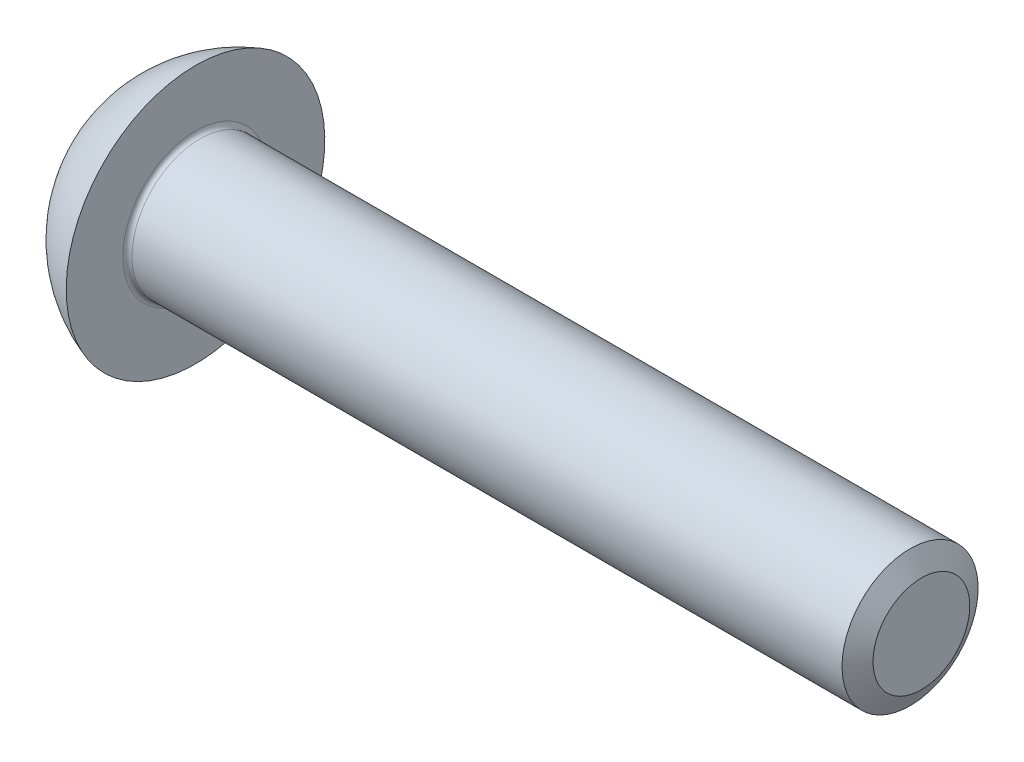
ISO-10303-21;
HEADER;
FILE_DESCRIPTION(('STEP AP214'),'2;1');
FILE_NAME('part.step','',(''),(''),'','','');
FILE_SCHEMA(('AUTOMOTIVE_DESIGN { 1 0 10303 214 1 1 1 1 }'));
ENDSEC;
DATA;
#1=APPLICATION_CONTEXT('core data for automotive mechanical design processes');
#2=APPLICATION_PROTOCOL_DEFINITION('international standard','automotive_design',2000,#1);
#3=PRODUCT_CONTEXT('',#1,'mechanical');
#4=PRODUCT('Part','Part','',(#3));
#5=PRODUCT_RELATED_PRODUCT_CATEGORY('part','',(#4));
#6=PRODUCT_DEFINITION_FORMATION('','',#4);
#7=PRODUCT_DEFINITION_CONTEXT('part definition',#1,'design');
#8=PRODUCT_DEFINITION('design','',#6,#7);
#9=PRODUCT_DEFINITION_SHAPE('','',#8);
#10=(LENGTH_UNIT() NAMED_UNIT(*) SI_UNIT(.MILLI.,.METRE.));
#11=(NAMED_UNIT(*) PLANE_ANGLE_UNIT() SI_UNIT($,.RADIAN.));
#12=(NAMED_UNIT(*) SI_UNIT($,.STERADIAN.) SOLID_ANGLE_UNIT());
#13=UNCERTAINTY_MEASURE_WITH_UNIT(LENGTH_MEASURE(1.E-05),#10,'distance_accuracy_value','');
#14=(GEOMETRIC_REPRESENTATION_CONTEXT(3) GLOBAL_UNCERTAINTY_ASSIGNED_CONTEXT((#13)) GLOBAL_UNIT_ASSIGNED_CONTEXT((#10,
#11,#12)) REPRESENTATION_CONTEXT('',''));
#15=CARTESIAN_POINT('',(0.,0.,0.));
#16=DIRECTION('',(0.,0.,1.));
#17=DIRECTION('',(1.,0.,0.));
#18=AXIS2_PLACEMENT_3D('',#15,#16,#17);
#19=CARTESIAN_POINT('',(-17.65,0.,0.));
#20=DIRECTION('',(-1.,0.,0.));
#21=DIRECTION('',(0.,0.,1.));
#22=AXIS2_PLACEMENT_3D('',#19,#20,#21);
#23=CYLINDRICAL_SURFACE('',#22,1.5);
#24=CARTESIAN_POINT('',(-15.9,0.,0.));
#25=DIRECTION('',(-1.,0.,0.));
#26=DIRECTION('',(0.,0.,1.));
#27=AXIS2_PLACEMENT_3D('',#24,#25,#26);
#28=CIRCLE('',#27,1.5);
#29=CARTESIAN_POINT('',(-15.9,0.,1.5));
#30=VERTEX_POINT('',#29);
#31=EDGE_CURVE('E260',#30,#30,#28,.T.);
#32=ORIENTED_EDGE('',*,*,#31,.F.);
#33=EDGE_LOOP('',(#32));
#34=FACE_BOUND('',#33,.T.);
#35=CARTESIAN_POINT('',(-0.25,0.,0.));
#36=DIRECTION('',(-1.,0.,0.));
#37=DIRECTION('',(0.,0.,1.));
#38=AXIS2_PLACEMENT_3D('',#35,#36,#37);
#39=CIRCLE('',#38,1.5);
#40=CARTESIAN_POINT('',(-0.25,0.,1.5));
#41=VERTEX_POINT('',#40);
#42=EDGE_CURVE('E405',#41,#41,#39,.T.);
#43=ORIENTED_EDGE('',*,*,#42,.T.);
#44=EDGE_LOOP('',(#43));
#45=FACE_BOUND('',#44,.T.);
#46=ADVANCED_FACE('F39',(#34,#45),#23,.T.);
#47=CARTESIAN_POINT('',(-17.65,0.,0.));
#48=DIRECTION('',(1.,0.,0.));
#49=DIRECTION('',(0.,0.,-1.));
#50=AXIS2_PLACEMENT_3D('',#47,#48,#49);
#51=PLANE('',#50);
#52=CARTESIAN_POINT('',(-17.65,0.,0.));
#53=DIRECTION('',(-1.,0.,0.));
#54=DIRECTION('',(0.,0.,1.));
#55=AXIS2_PLACEMENT_3D('',#52,#53,#54);
#56=CIRCLE('',#55,1.5);
#57=CARTESIAN_POINT('',(-17.65,1.5,0.));
#58=VERTEX_POINT('',#57);
#59=EDGE_CURVE('E252',#58,#58,#56,.T.);
#60=ORIENTED_EDGE('',*,*,#59,.T.);
#61=EDGE_LOOP('',(#60));
#62=FACE_BOUND('',#61,.T.);
#63=CARTESIAN_POINT('',(-17.65,0.,0.));
#64=DIRECTION('',(1.,0.,0.));
#65=DIRECTION('',(0.,0.,-1.));
#66=AXIS2_PLACEMENT_3D('',#63,#64,#65);
#67=CIRCLE('',#66,1.15470053837925);
#68=CARTESIAN_POINT('',(-17.65,-0.577350269189627,-1.));
#69=VERTEX_POINT('',#68);
#70=CARTESIAN_POINT('',(-17.65,-1.15470053837925,0.));
#71=VERTEX_POINT('',#70);
#72=EDGE_CURVE('E11',#69,#71,#67,.F.);
#73=ORIENTED_EDGE('',*,*,#72,.F.);
#74=CARTESIAN_POINT('',(-17.65,0.577350269189628,-1.));
#75=VERTEX_POINT('',#74);
#76=EDGE_CURVE('E43',#75,#69,#67,.F.);
#77=ORIENTED_EDGE('',*,*,#76,.F.);
#78=CARTESIAN_POINT('',(-17.65,1.15470053837925,0.));
#79=VERTEX_POINT('',#78);
#80=EDGE_CURVE('E112',#79,#75,#67,.F.);
#81=ORIENTED_EDGE('',*,*,#80,.F.);
#82=CARTESIAN_POINT('',(-17.65,0.,0.));
#83=DIRECTION('',(-1.,0.,0.));
#84=DIRECTION('',(0.,0.,1.));
#85=AXIS2_PLACEMENT_3D('',#82,#83,#84);
#86=CIRCLE('',#85,1.15470053837925);
#87=CARTESIAN_POINT('',(-17.65,0.577350269189629,1.));
#88=VERTEX_POINT('',#87);
#89=EDGE_CURVE('E132',#88,#79,#86,.T.);
#90=ORIENTED_EDGE('',*,*,#89,.F.);
#91=CARTESIAN_POINT('',(-17.65,-0.577350269189633,0.999999999999999));
#92=VERTEX_POINT('',#91);
#93=EDGE_CURVE('E326',#92,#88,#67,.F.);
#94=ORIENTED_EDGE('',*,*,#93,.F.);
#95=EDGE_CURVE('E48',#71,#92,#67,.F.);
#96=ORIENTED_EDGE('',*,*,#95,.F.);
#97=EDGE_LOOP('',(#73,#77,#81,#90,#94,#96));
#98=FACE_BOUND('',#97,.T.);
#99=ADVANCED_FACE('F41',(#62,#98),#51,.F.);
#100=CARTESIAN_POINT('',(-15.0454545454545,0.,0.));
#101=DIRECTION('',(-1.,0.,0.));
#102=DIRECTION('',(0.,1.,0.));
#103=AXIS2_PLACEMENT_3D('',#100,#101,#102);
#104=SPHERICAL_SURFACE('',#103,3.00560426949281);
#105=CARTESIAN_POINT('',(-16.,0.,0.));
#106=DIRECTION('',(-1.,0.,0.));
#107=DIRECTION('',(0.,0.,1.));
#108=AXIS2_PLACEMENT_3D('',#105,#106,#107);
#109=CIRCLE('',#108,2.85);
#110=CARTESIAN_POINT('',(-16.,2.85,0.));
#111=VERTEX_POINT('',#110);
#112=EDGE_CURVE('E255',#111,#111,#109,.T.);
#113=CARTESIAN_POINT('',(-17.65,1.5,0.));
#114=CARTESIAN_POINT('',(-17.6386705331495,1.51967216925548,0.));
#115=CARTESIAN_POINT('',(-17.6271181108235,1.53921593268644,0.));
#116=CARTESIAN_POINT('',(-17.6035734644196,1.57803672196104,0.));
#117=CARTESIAN_POINT('',(-17.5915812403415,1.59731374780469,0.));
#118=CARTESIAN_POINT('',(-17.5671630996322,1.6355911359664,0.));
#119=CARTESIAN_POINT('',(-17.554737183001,1.65459149828447,0.));
#120=CARTESIAN_POINT('',(-17.5294580495481,1.69230581219272,0.));
#121=CARTESIAN_POINT('',(-17.5166048327265,1.7110197637829,0.));
#122=CARTESIAN_POINT('',(-17.4904776944242,1.74815164624668,0.));
#123=CARTESIAN_POINT('',(-17.4772037729434,1.76656957712027,0.));
#124=CARTESIAN_POINT('',(-17.4502420411911,1.80309996277641,0.));
#125=CARTESIAN_POINT('',(-17.4365542309196,1.82121241755895,0.));
#126=CARTESIAN_POINT('',(-17.4087717487848,1.85712255178676,0.));
#127=CARTESIAN_POINT('',(-17.3946770769215,1.87492023123203,0.));
#128=CARTESIAN_POINT('',(-17.366088108,1.91019167733672,0.));
#129=CARTESIAN_POINT('',(-17.3515938109419,1.92766544399614,0.));
#130=CARTESIAN_POINT('',(-17.3222130331156,1.96228009332959,0.));
#131=CARTESIAN_POINT('',(-17.3073265523475,1.97942097600363,0.));
#132=CARTESIAN_POINT('',(-17.2771690499588,2.013361057086,0.));
#133=CARTESIAN_POINT('',(-17.2618980283382,2.03016025549433,0.));
#134=CARTESIAN_POINT('',(-17.2309792845233,2.06340834318511,0.));
#135=CARTESIAN_POINT('',(-17.2153315623289,2.07985723246756,0.));
#136=CARTESIAN_POINT('',(-17.1836674510477,2.11239625689921,0.));
#137=CARTESIAN_POINT('',(-17.1676510619609,2.12848639204841,0.));
#138=CARTESIAN_POINT('',(-17.1352578398529,2.16029964739355,0.));
#139=CARTESIAN_POINT('',(-17.1188810068317,2.17602276758948,0.));
#140=CARTESIAN_POINT('',(-17.0857753048683,2.2070939206369,0.));
#141=CARTESIAN_POINT('',(-17.069046435926,2.22244195348839,0.));
#142=CARTESIAN_POINT('',(-17.0352452508718,2.25275505202893,0.));
#143=CARTESIAN_POINT('',(-17.01817293476,2.26772011771799,0.));
#144=CARTESIAN_POINT('',(-16.9836936204474,2.29725959873447,0.));
#145=CARTESIAN_POINT('',(-16.9662866222466,2.3118340140619,0.));
#146=CARTESIAN_POINT('',(-16.9311468806653,2.34058471171934,0.));
#147=CARTESIAN_POINT('',(-16.9134141372848,2.35476099404935,0.));
#148=CARTESIAN_POINT('',(-16.8776320094939,2.38270814748122,0.));
#149=CARTESIAN_POINT('',(-16.8595826250834,2.39647901858308,0.));
#150=CARTESIAN_POINT('',(-16.8231764819488,2.42360827946968,0.));
#151=CARTESIAN_POINT('',(-16.8048197232246,2.43696666925442,0.));
#152=CARTESIAN_POINT('',(-16.7678082559874,2.46326410918943,0.));
#153=CARTESIAN_POINT('',(-16.7491535474743,2.4762031593397,0.));
#154=CARTESIAN_POINT('',(-16.7115557581542,2.50165527698115,0.));
#155=CARTESIAN_POINT('',(-16.6926126773472,2.51416834447232,0.));
#156=CARTESIAN_POINT('',(-16.6544478689872,2.53876207247436,0.));
#157=CARTESIAN_POINT('',(-16.6352261414343,2.55084273298524,0.));
#158=CARTESIAN_POINT('',(-16.5965139081898,2.57456544470666,0.));
#159=CARTESIAN_POINT('',(-16.5770234024984,2.5862074959172,0.));
#160=CARTESIAN_POINT('',(-16.5377836195783,2.60904701190566,0.));
#161=CARTESIAN_POINT('',(-16.5180343423497,2.62024447668356,0.));
#162=CARTESIAN_POINT('',(-16.4782871558097,2.6421890709225,0.));
#163=CARTESIAN_POINT('',(-16.4582892464984,2.65293620038353,0.));
#164=CARTESIAN_POINT('',(-16.4180550629064,2.67397460633529,0.));
#165=CARTESIAN_POINT('',(-16.3978187886257,2.68426588282604,0.));
#166=CARTESIAN_POINT('',(-16.3571182645539,2.70438729913089,0.));
#167=CARTESIAN_POINT('',(-16.3366540147628,2.714217438945,0.));
#168=CARTESIAN_POINT('',(-16.2955080462974,2.73341153528513,0.));
#169=CARTESIAN_POINT('',(-16.2748263276231,2.74277549181114,0.));
#170=CARTESIAN_POINT('',(-16.2332560392077,2.7610324130256,0.));
#171=CARTESIAN_POINT('',(-16.2123674694665,2.76992537771405,0.));
#172=CARTESIAN_POINT('',(-16.1703942046549,2.78723575329491,0.));
#173=CARTESIAN_POINT('',(-16.1493095095844,2.79565316418733,0.));
#174=CARTESIAN_POINT('',(-16.1069548141172,2.81200809653372,0.));
#175=CARTESIAN_POINT('',(-16.0856848137203,2.8199456179877,0.));
#176=CARTESIAN_POINT('',(-16.0429704467276,2.83533674876495,0.));
#177=CARTESIAN_POINT('',(-16.0215260801317,2.84279035808822,0.));
#178=CARTESIAN_POINT('',(-16.,2.85,0.));
#179=B_SPLINE_CURVE_WITH_KNOTS('',3,(#113,#114,#115,#116,#117,#118,#119,#120,#121,#122,#123,
#124,#125,#126,#127,#128,#129,#130,#131,#132,#133,#134,#135,#136,#137,#138,#139,#140,#141,#142,
#143,#144,#145,#146,#147,#148,#149,#150,#151,#152,#153,#154,#155,#156,#157,#158,#159,#160,#161,
#162,#163,#164,#165,#166,#167,#168,#169,#170,#171,#172,#173,#174,#175,#176,#177,#178),
.UNSPECIFIED.,.F.,.F.,(4,2,2,2,2,2,2,2,2,2,2,2,2,2,2,2,2,2,2,2,2,2,2,2,2,2,2,2,2,2,2,2,4),(0.,
0.0681025747754081,0.136205149550819,0.204307724326227,0.272410299101636,0.340512873877047,
0.408615448652457,0.476718023427866,0.544820598203275,0.612923172978686,0.681025747754095,
0.749128322529505,0.817230897304915,0.885333472080324,0.953436046855732,1.02153862163114,
1.08964119640655,1.15774377118196,1.22584634595737,1.29394892073278,1.36205149550819,
1.4301540702836,1.49825664505901,1.56635921983442,1.63446179460983,1.70256436938524,
1.77066694416065,1.83876951893606,1.90687209371147,1.97497466848688,2.04307724326229,
2.11117981803769,2.1792823928131),.UNSPECIFIED.);
#180=EDGE_CURVE('BSEAM241',#58,#111,#179,.T.);
#181=ORIENTED_EDGE('',*,*,#59,.F.);
#182=ORIENTED_EDGE('',*,*,#112,.T.);
#183=ORIENTED_EDGE('',*,*,#180,.T.);
#184=ORIENTED_EDGE('',*,*,#180,.F.);
#185=EDGE_LOOP('',(#181,#183,#182,#184));
#186=FACE_BOUND('',#185,.T.);
#187=ADVANCED_FACE('F241',(#186),#104,.T.);
#188=CARTESIAN_POINT('',(-16.,1.6,0.));
#189=DIRECTION('',(-1.,0.,0.));
#190=DIRECTION('',(0.,0.,1.));
#191=AXIS2_PLACEMENT_3D('',#188,#189,#190);
#192=PLANE('',#191);
#193=ORIENTED_EDGE('',*,*,#112,.F.);
#194=EDGE_LOOP('',(#193));
#195=FACE_BOUND('',#194,.T.);
#196=CARTESIAN_POINT('',(-16.,0.,0.));
#197=DIRECTION('',(-1.,0.,0.));
#198=DIRECTION('',(0.,0.,1.));
#199=AXIS2_PLACEMENT_3D('',#196,#197,#198);
#200=CIRCLE('',#199,1.6);
#201=CARTESIAN_POINT('',(-16.,0.,1.6));
#202=VERTEX_POINT('',#201);
#203=EDGE_CURVE('E256',#202,#202,#200,.T.);
#204=ORIENTED_EDGE('',*,*,#203,.T.);
#205=EDGE_LOOP('',(#204));
#206=FACE_BOUND('',#205,.T.);
#207=ADVANCED_FACE('F238',(#195,#206),#192,.F.);
#208=CARTESIAN_POINT('',(-15.9,0.,0.));
#209=DIRECTION('',(-1.,0.,0.));
#210=DIRECTION('',(0.,0.,1.));
#211=AXIS2_PLACEMENT_3D('',#208,#209,#210);
#212=TOROIDAL_SURFACE('',#211,1.6,0.0999999999999997);
#213=ORIENTED_EDGE('',*,*,#203,.F.);
#214=EDGE_LOOP('',(#213));
#215=FACE_BOUND('',#214,.T.);
#216=ORIENTED_EDGE('',*,*,#31,.T.);
#217=EDGE_LOOP('',(#216));
#218=FACE_BOUND('',#217,.T.);
#219=ADVANCED_FACE('F235',(#215,#218),#212,.F.);
#220=CARTESIAN_POINT('',(-17.35,0.,0.));
#221=DIRECTION('',(-1.,0.,0.));
#222=DIRECTION('',(0.,0.,1.));
#223=AXIS2_PLACEMENT_3D('',#220,#221,#222);
#224=CONICAL_SURFACE('',#223,0.,1.31660847419538);
#225=CARTESIAN_POINT('',(-17.8201338061757,-1.5081300450323,-1.));
#226=CARTESIAN_POINT('',(-17.8103550434582,-1.46296169551438,-1.));
#227=CARTESIAN_POINT('',(-17.8007010634319,-1.41776633015547,-1.));
#228=CARTESIAN_POINT('',(-17.7817057249496,-1.32730802004725,-1.));
#229=CARTESIAN_POINT('',(-17.7723643798043,-1.28204507250605,-1.));
#230=CARTESIAN_POINT('',(-17.744887707109,-1.1460540932135,-1.));
#231=CARTESIAN_POINT('',(-17.727318593487,-1.05520983554783,-1.));
#232=CARTESIAN_POINT('',(-17.6946113120355,-0.873838301527069,-1.));
#233=CARTESIAN_POINT('',(-17.6794545669183,-0.783314439111169,-1.));
#234=CARTESIAN_POINT('',(-17.6526000869216,-0.601754544937859,-1.));
#235=CARTESIAN_POINT('',(-17.6409016960468,-0.510718613654572,-1.));
#236=CARTESIAN_POINT('',(-17.6224688104588,-0.327147289363391,-1.));
#237=CARTESIAN_POINT('',(-17.615787761882,-0.23460619153087,-1.));
#238=CARTESIAN_POINT('',(-17.6090368362792,-0.0493046546038947,-1.));
#239=CARTESIAN_POINT('',(-17.6089640024594,0.0434556678202297,-1.));
#240=CARTESIAN_POINT('',(-17.6154534933963,0.229083736297403,-1.));
#241=CARTESIAN_POINT('',(-17.6220414736928,0.321950510989406,-1.));
#242=CARTESIAN_POINT('',(-17.6404572139866,0.507192547661315,-1.));
#243=CARTESIAN_POINT('',(-17.6522884816114,0.599567438647759,-1.));
#244=CARTESIAN_POINT('',(-17.6798118313046,0.785811374344468,-1.));
#245=CARTESIAN_POINT('',(-17.6955836030667,0.87966821099882,-1.));
#246=CARTESIAN_POINT('',(-17.7295232966728,1.06695285350417,-1.));
#247=CARTESIAN_POINT('',(-17.7476915787193,1.16038059267177,-1.));
#248=CARTESIAN_POINT('',(-17.7855853163011,1.34694314919725,-1.));
#249=CARTESIAN_POINT('',(-17.8053112029702,1.44007787798178,-1.));
#250=CARTESIAN_POINT('',(-17.8457971322914,1.62612272763755,-1.));
#251=CARTESIAN_POINT('',(-17.866557196056,1.71903284388273,-1.));
#252=CARTESIAN_POINT('',(-17.9085485742601,1.90363742744431,-1.));
#253=CARTESIAN_POINT('',(-17.9297718689088,1.99533372655925,-1.));
#254=CARTESIAN_POINT('',(-17.9727143057913,2.17861191601366,-1.));
#255=CARTESIAN_POINT('',(-17.9944334585808,2.27019380387372,-1.));
#256=CARTESIAN_POINT('',(-18.0382042420233,2.45314970796373,-1.));
#257=CARTESIAN_POINT('',(-18.0602553943374,2.54452383886908,-1.));
#258=CARTESIAN_POINT('',(-18.1046332471854,2.72720190599483,-1.));
#259=CARTESIAN_POINT('',(-18.1269599382911,2.8185058445041,-1.));
#260=CARTESIAN_POINT('',(-18.1493826695211,2.9097859214388,-1.));
#261=B_SPLINE_CURVE_WITH_KNOTS('',3,(#225,#226,#227,#228,#229,#230,#231,#232,#233,#234,#235,
#236,#237,#238,#239,#240,#241,#242,#243,#244,#245,#246,#247,#248,#249,#250,#251,#252,#253,#254,
#255,#256,#257,#258,#259,#260),.UNSPECIFIED.,.F.,.F.,(4,2,2,2,2,2,2,2,2,2,2,2,2,2,2,2,2,4),(0.,
0.138643869889783,0.277293635233151,0.554857004517541,0.830167022781704,1.10542478551794,
1.38357462934897,1.66160001660695,1.94070037269331,2.21998772241579,2.50545939030144,
2.79097401441239,3.07656794584651,3.36216771000261,3.64452690710852,3.92689212062334,
4.20888343548738,4.49086512790397),.UNSPECIFIED.);
#262=EDGE_CURVE('E103',#69,#75,#261,.T.);
#263=ORIENTED_EDGE('',*,*,#262,.T.);
#264=ORIENTED_EDGE('',*,*,#76,.T.);
#265=EDGE_LOOP('',(#263,#264));
#266=FACE_BOUND('',#265,.T.);
#267=ADVANCED_FACE('F107',(#266),#224,.F.);
#268=CARTESIAN_POINT('',(-17.6500300044995,0.57723479913579,-1.0002));
#269=CARTESIAN_POINT('',(-17.6437929192042,0.601225021738601,-0.958647715567044));
#270=CARTESIAN_POINT('',(-17.6381313786167,0.625256195021443,-0.917024502475672));
#271=CARTESIAN_POINT('',(-17.6281854217223,0.673398386330441,-0.833639781140785));
#272=CARTESIAN_POINT('',(-17.6239015302713,0.697509431260086,-0.791878226299064));
#273=CARTESIAN_POINT('',(-17.6169589031667,0.745673772514857,-0.708455140132715));
#274=CARTESIAN_POINT('',(-17.6142923745456,0.769726780462719,-0.66679410829216));
#275=CARTESIAN_POINT('',(-17.6107168929941,0.817861664223351,-0.583422044002323));
#276=CARTESIAN_POINT('',(-17.6098076211353,0.841943534003896,-0.541711022001162));
#277=CARTESIAN_POINT('',(-17.6098076211353,0.890107273564986,-0.458288977998839));
#278=CARTESIAN_POINT('',(-17.6107168929941,0.914189143345531,-0.416577955997678));
#279=CARTESIAN_POINT('',(-17.6142923745456,0.962324027106163,-0.333205891707841));
#280=CARTESIAN_POINT('',(-17.6169589031667,0.986377035054025,-0.291544859867286));
#281=CARTESIAN_POINT('',(-17.6239015302713,1.0345413763088,-0.208121773700937));
#282=CARTESIAN_POINT('',(-17.6281854217223,1.05865242123844,-0.166360218859216));
#283=CARTESIAN_POINT('',(-17.6381313786167,1.10679461254744,-0.0829754975243296));
#284=CARTESIAN_POINT('',(-17.6437929192042,1.13082578583028,-0.0413522844329569));
#285=CARTESIAN_POINT('',(-17.6500300044996,1.15481600843309,0.000199999999998983));
#286=B_SPLINE_CURVE_WITH_KNOTS('',3,(#268,#269,#270,#271,#272,#273,#274,#275,#276,#277,#278,
#279,#280,#281,#282,#283,#284,#285),.UNSPECIFIED.,.F.,.F.,(4,2,2,2,2,2,2,2,4),(0.,
0.145159524820138,0.290374287087485,0.434883682122849,0.57936684736763,0.723850012612412,
0.868359407647777,1.01357416991512,1.15873369473526),.UNSPECIFIED.);
#287=EDGE_CURVE('E130',#75,#79,#286,.T.);
#288=ORIENTED_EDGE('',*,*,#287,.T.);
#289=ORIENTED_EDGE('',*,*,#80,.T.);
#290=EDGE_LOOP('',(#288,#289));
#291=FACE_BOUND('',#290,.T.);
#292=ADVANCED_FACE('F159',(#291),#224,.F.);
#293=CARTESIAN_POINT('',(-17.6500300044996,1.15481600843309,-0.000200000000000797));
#294=CARTESIAN_POINT('',(-17.6437929192042,1.13082578583028,0.0413522844329552));
#295=CARTESIAN_POINT('',(-17.6381313786167,1.10679461254744,0.0829754975243279));
#296=CARTESIAN_POINT('',(-17.6281854217223,1.05865242123844,0.166360218859215));
#297=CARTESIAN_POINT('',(-17.6239015302713,1.0345413763088,0.208121773700935));
#298=CARTESIAN_POINT('',(-17.6169589031667,0.986377035054025,0.291544859867285));
#299=CARTESIAN_POINT('',(-17.6142923745456,0.962324027106163,0.33320589170784));
#300=CARTESIAN_POINT('',(-17.6107168929941,0.914189143345531,0.416577955997676));
#301=CARTESIAN_POINT('',(-17.6098076211353,0.890107273564986,0.458288977998838));
#302=CARTESIAN_POINT('',(-17.6098076211353,0.841943534003896,0.541711022001161));
#303=CARTESIAN_POINT('',(-17.6107168929941,0.817861664223351,0.583422044002322));
#304=CARTESIAN_POINT('',(-17.6142923745456,0.769726780462719,0.666794108292158));
#305=CARTESIAN_POINT('',(-17.6169589031667,0.745673772514857,0.708455140132713));
#306=CARTESIAN_POINT('',(-17.6239015302713,0.697509431260086,0.791878226299063));
#307=CARTESIAN_POINT('',(-17.6281854217223,0.673398386330441,0.833639781140783));
#308=CARTESIAN_POINT('',(-17.6381313786167,0.625256195021442,0.91702450247567));
#309=CARTESIAN_POINT('',(-17.6437929192042,0.601225021738601,0.958647715567043));
#310=CARTESIAN_POINT('',(-17.6500300044995,0.57723479913579,1.0002));
#311=B_SPLINE_CURVE_WITH_KNOTS('',3,(#293,#294,#295,#296,#297,#298,#299,#300,#301,#302,#303,
#304,#305,#306,#307,#308,#309,#310),.UNSPECIFIED.,.F.,.F.,(4,2,2,2,2,2,2,2,4),(0.,
0.145159524820137,0.290374287087485,0.43488368212285,0.579366847367631,0.723850012612412,
0.868359407647777,1.01357416991512,1.15873369473526),.UNSPECIFIED.);
#312=EDGE_CURVE('E181',#79,#88,#311,.T.);
#313=ORIENTED_EDGE('',*,*,#312,.T.);
#314=ORIENTED_EDGE('',*,*,#89,.T.);
#315=EDGE_LOOP('',(#313,#314));
#316=FACE_BOUND('',#315,.T.);
#317=ADVANCED_FACE('F153',(#316),#224,.F.);
#318=CARTESIAN_POINT('',(-17.8201338061757,-1.5081300450323,0.999999999999999));
#319=CARTESIAN_POINT('',(-17.8103550434582,-1.46296169551439,0.999999999999999));
#320=CARTESIAN_POINT('',(-17.8007010634319,-1.41776633015547,0.999999999999999));
#321=CARTESIAN_POINT('',(-17.7817057249496,-1.32730802004725,0.999999999999999));
#322=CARTESIAN_POINT('',(-17.7723643798043,-1.28204507250605,0.999999999999999));
#323=CARTESIAN_POINT('',(-17.744887707109,-1.1460540932135,0.999999999999999));
#324=CARTESIAN_POINT('',(-17.727318593487,-1.05520983554783,0.999999999999999));
#325=CARTESIAN_POINT('',(-17.6946113120355,-0.87383830152707,0.999999999999999));
#326=CARTESIAN_POINT('',(-17.6794545669183,-0.78331443911117,0.999999999999999));
#327=CARTESIAN_POINT('',(-17.6526000869216,-0.601754544937859,0.999999999999999));
#328=CARTESIAN_POINT('',(-17.6409016960468,-0.510718613654572,0.999999999999999));
#329=CARTESIAN_POINT('',(-17.6224688104588,-0.327147289363391,0.999999999999999));
#330=CARTESIAN_POINT('',(-17.615787761882,-0.23460619153087,0.999999999999999));
#331=CARTESIAN_POINT('',(-17.6090368362792,-0.049304654603895,0.999999999999999));
#332=CARTESIAN_POINT('',(-17.6089640024594,0.0434556678202295,0.999999999999999));
#333=CARTESIAN_POINT('',(-17.6154534933963,0.229083736297403,0.999999999999999));
#334=CARTESIAN_POINT('',(-17.6220414736928,0.321950510989406,0.999999999999999));
#335=CARTESIAN_POINT('',(-17.6404572139866,0.507192547661315,0.999999999999999));
#336=CARTESIAN_POINT('',(-17.6522884816114,0.599567438647759,0.999999999999999));
#337=CARTESIAN_POINT('',(-17.6798118313046,0.785811374344468,0.999999999999999));
#338=CARTESIAN_POINT('',(-17.6955836030667,0.879668210998819,0.999999999999999));
#339=CARTESIAN_POINT('',(-17.7295232966728,1.06695285350416,0.999999999999999));
#340=CARTESIAN_POINT('',(-17.7476915787193,1.16038059267177,0.999999999999999));
#341=CARTESIAN_POINT('',(-17.7855853163011,1.34694314919725,0.999999999999999));
#342=CARTESIAN_POINT('',(-17.8053112029702,1.44007787798178,0.999999999999999));
#343=CARTESIAN_POINT('',(-17.8457971322914,1.62612272763755,0.999999999999999));
#344=CARTESIAN_POINT('',(-17.866557196056,1.71903284388273,0.999999999999999));
#345=CARTESIAN_POINT('',(-17.9085485742601,1.90363742744431,0.999999999999999));
#346=CARTESIAN_POINT('',(-17.9297718689088,1.99533372655925,0.999999999999999));
#347=CARTESIAN_POINT('',(-17.9727143057913,2.17861191601366,0.999999999999999));
#348=CARTESIAN_POINT('',(-17.9944334585808,2.27019380387372,0.999999999999999));
#349=CARTESIAN_POINT('',(-18.0382042420233,2.45314970796373,0.999999999999999));
#350=CARTESIAN_POINT('',(-18.0602553943374,2.54452383886908,0.999999999999999));
#351=CARTESIAN_POINT('',(-18.1046332471854,2.72720190599483,0.999999999999999));
#352=CARTESIAN_POINT('',(-18.1269599382911,2.81850584450411,0.999999999999999));
#353=CARTESIAN_POINT('',(-18.1493826695211,2.9097859214388,0.999999999999999));
#354=B_SPLINE_CURVE_WITH_KNOTS('',3,(#318,#319,#320,#321,#322,#323,#324,#325,#326,#327,#328,
#329,#330,#331,#332,#333,#334,#335,#336,#337,#338,#339,#340,#341,#342,#343,#344,#345,#346,#347,
#348,#349,#350,#351,#352,#353),.UNSPECIFIED.,.F.,.F.,(4,2,2,2,2,2,2,2,2,2,2,2,2,2,2,2,2,4),(0.,
0.138643869889783,0.277293635233152,0.554857004517542,0.830167022781704,1.10542478551794,
1.38357462934897,1.66160001660695,1.94070037269331,2.21998772241579,2.50545939030144,
2.79097401441239,3.07656794584651,3.36216771000261,3.64452690710852,3.92689212062334,
4.20888343548738,4.49086512790397),.UNSPECIFIED.);
#355=EDGE_CURVE('E60',#88,#92,#354,.F.);
#356=ORIENTED_EDGE('',*,*,#355,.T.);
#357=ORIENTED_EDGE('',*,*,#93,.T.);
#358=EDGE_LOOP('',(#356,#357));
#359=FACE_BOUND('',#358,.T.);
#360=ADVANCED_FACE('F158',(#359),#224,.F.);
#361=CARTESIAN_POINT('',(-17.6500300044995,-0.577234799135789,1.0002));
#362=CARTESIAN_POINT('',(-17.6437929192042,-0.6012250217386,0.958647715567043));
#363=CARTESIAN_POINT('',(-17.6381313786167,-0.625256195021441,0.91702450247567));
#364=CARTESIAN_POINT('',(-17.6281854217223,-0.67339838633044,0.833639781140783));
#365=CARTESIAN_POINT('',(-17.6239015302713,-0.697509431260085,0.791878226299063));
#366=CARTESIAN_POINT('',(-17.6169589031667,-0.745673772514856,0.708455140132713));
#367=CARTESIAN_POINT('',(-17.6142923745456,-0.769726780462718,0.666794108292158));
#368=CARTESIAN_POINT('',(-17.6107168929941,-0.81786166422335,0.583422044002322));
#369=CARTESIAN_POINT('',(-17.6098076211353,-0.841943534003895,0.54171102200116));
#370=CARTESIAN_POINT('',(-17.6098076211353,-0.890107273564985,0.458288977998838));
#371=CARTESIAN_POINT('',(-17.6107168929941,-0.914189143345529,0.416577955997676));
#372=CARTESIAN_POINT('',(-17.6142923745456,-0.962324027106161,0.33320589170784));
#373=CARTESIAN_POINT('',(-17.6169589031667,-0.986377035054023,0.291544859867285));
#374=CARTESIAN_POINT('',(-17.6239015302713,-1.03454137630879,0.208121773700935));
#375=CARTESIAN_POINT('',(-17.6281854217223,-1.05865242123844,0.166360218859215));
#376=CARTESIAN_POINT('',(-17.6381313786167,-1.10679461254744,0.0829754975243279));
#377=CARTESIAN_POINT('',(-17.6437929192042,-1.13082578583028,0.0413522844329551));
#378=CARTESIAN_POINT('',(-17.6500300044995,-1.15481600843309,-0.000200000000000986));
#379=B_SPLINE_CURVE_WITH_KNOTS('',3,(#361,#362,#363,#364,#365,#366,#367,#368,#369,#370,#371,
#372,#373,#374,#375,#376,#377,#378),.UNSPECIFIED.,.F.,.F.,(4,2,2,2,2,2,2,2,4),(0.,
0.145159524820138,0.290374287087485,0.434883682122849,0.57936684736763,0.723850012612411,
0.868359407647776,1.01357416991512,1.15873369473526),.UNSPECIFIED.);
#380=EDGE_CURVE('E54',#92,#71,#379,.T.);
#381=ORIENTED_EDGE('',*,*,#380,.T.);
#382=ORIENTED_EDGE('',*,*,#95,.T.);
#383=EDGE_LOOP('',(#381,#382));
#384=FACE_BOUND('',#383,.T.);
#385=ADVANCED_FACE('F312',(#384),#224,.F.);
#386=CARTESIAN_POINT('',(-17.6500300044995,-1.15481600843309,0.0001999999999991));
#387=CARTESIAN_POINT('',(-17.6437929192042,-1.13082578583028,-0.0413522844329571));
#388=CARTESIAN_POINT('',(-17.6381313786167,-1.10679461254744,-0.0829754975243299));
#389=CARTESIAN_POINT('',(-17.6281854217223,-1.05865242123844,-0.166360218859217));
#390=CARTESIAN_POINT('',(-17.6239015302713,-1.03454137630879,-0.208121773700937));
#391=CARTESIAN_POINT('',(-17.6169589031667,-0.986377035054023,-0.291544859867287));
#392=CARTESIAN_POINT('',(-17.6142923745456,-0.962324027106161,-0.333205891707842));
#393=CARTESIAN_POINT('',(-17.6107168929941,-0.914189143345529,-0.416577955997678));
#394=CARTESIAN_POINT('',(-17.6098076211353,-0.890107273564984,-0.458288977998839));
#395=CARTESIAN_POINT('',(-17.6098076211353,-0.841943534003895,-0.541711022001162));
#396=CARTESIAN_POINT('',(-17.6107168929941,-0.81786166422335,-0.583422044002323));
#397=CARTESIAN_POINT('',(-17.6142923745456,-0.769726780462718,-0.66679410829216));
#398=CARTESIAN_POINT('',(-17.6169589031667,-0.745673772514856,-0.708455140132715));
#399=CARTESIAN_POINT('',(-17.6239015302713,-0.697509431260084,-0.791878226299065));
#400=CARTESIAN_POINT('',(-17.6281854217223,-0.67339838633044,-0.833639781140785));
#401=CARTESIAN_POINT('',(-17.6381313786167,-0.625256195021441,-0.917024502475672));
#402=CARTESIAN_POINT('',(-17.6437929192042,-0.6012250217386,-0.958647715567044));
#403=CARTESIAN_POINT('',(-17.6500300044995,-0.577234799135788,-1.0002));
#404=B_SPLINE_CURVE_WITH_KNOTS('',3,(#386,#387,#388,#389,#390,#391,#392,#393,#394,#395,#396,
#397,#398,#399,#400,#401,#402,#403),.UNSPECIFIED.,.F.,.F.,(4,2,2,2,2,2,2,2,4),(0.,
0.145159524820137,0.290374287087485,0.43488368212285,0.579366847367631,0.723850012612411,
0.868359407647776,1.01357416991512,1.15873369473526),.UNSPECIFIED.);
#405=EDGE_CURVE('E95',#71,#69,#404,.T.);
#406=ORIENTED_EDGE('',*,*,#405,.T.);
#407=ORIENTED_EDGE('',*,*,#72,.T.);
#408=EDGE_LOOP('',(#406,#407));
#409=FACE_BOUND('',#408,.T.);
#410=ADVANCED_FACE('F97',(#409),#224,.F.);
#411=CARTESIAN_POINT('',(-16.61,0.,0.));
#412=DIRECTION('',(-1.,0.,0.));
#413=DIRECTION('',(0.,0.,1.));
#414=AXIS2_PLACEMENT_3D('',#411,#412,#413);
#415=CONICAL_SURFACE('',#414,1.15470053837925,1.08478502970568);
#416=CARTESIAN_POINT('',(-16.,0.,0.));
#417=VERTEX_POINT('',#416);
#418=VERTEX_LOOP('',#417);
#419=FACE_BOUND('',#418,.T.);
#420=CARTESIAN_POINT('',(-16.9533777683403,-1.50230992873525,0.999999999999999));
#421=CARTESIAN_POINT('',(-16.9340444769777,-1.45833854185076,0.999999999999999));
#422=CARTESIAN_POINT('',(-16.9149232467738,-1.41427434344668,0.999999999999999));
#423=CARTESIAN_POINT('',(-16.8772163059513,-1.32590919920825,0.999999999999999));
#424=CARTESIAN_POINT('',(-16.8586306830292,-1.28160821599644,0.999999999999999));
#425=CARTESIAN_POINT('',(-16.8036681478386,-1.14784319726152,0.999999999999999));
#426=CARTESIAN_POINT('',(-16.7682844804861,-1.05796321251932,0.999999999999999));
#427=CARTESIAN_POINT('',(-16.7014887265583,-0.87612343816072,0.999999999999999));
#428=CARTESIAN_POINT('',(-16.670100993813,-0.784154578942249,0.999999999999999));
#429=CARTESIAN_POINT('',(-16.6142698926597,-0.598229842457831,0.999999999999999));
#430=CARTESIAN_POINT('',(-16.5898112637181,-0.504278829186387,0.999999999999999));
#431=CARTESIAN_POINT('',(-16.561284211292,-0.361662527207036,0.999999999999999));
#432=CARTESIAN_POINT('',(-16.5531336537351,-0.313821896859327,0.999999999999999));
#433=CARTESIAN_POINT('',(-16.5400901383612,-0.217683951682428,0.999999999999999));
#434=CARTESIAN_POINT('',(-16.5351973854909,-0.169386608315469,0.999999999999999));
#435=CARTESIAN_POINT('',(-16.5290689217004,-0.0727543492205687,0.999999999999999));
#436=CARTESIAN_POINT('',(-16.5278181907857,-0.0244204124532985,0.999999999999999));
#437=CARTESIAN_POINT('',(-16.5290340461929,0.0721832270827304,0.999999999999999));
#438=CARTESIAN_POINT('',(-16.5314996115354,0.120452943848543,0.999999999999999));
#439=CARTESIAN_POINT('',(-16.5426858199704,0.247728096968899,0.999999999999999));
#440=CARTESIAN_POINT('',(-16.554415626327,0.326472817075769,0.999999999999999));
#441=CARTESIAN_POINT('',(-16.5853155073204,0.482611029430832,0.999999999999999));
#442=CARTESIAN_POINT('',(-16.6045054158237,0.560000340052674,0.999999999999999));
#443=CARTESIAN_POINT('',(-16.6484420949321,0.714868516061646,0.999999999999999));
#444=CARTESIAN_POINT('',(-16.6732951431871,0.792316418029709,0.999999999999999));
#445=CARTESIAN_POINT('',(-16.7131493499715,0.907307575681683,0.999999999999999));
#446=CARTESIAN_POINT('',(-16.7268173023165,0.945326191835167,0.999999999999999));
#447=CARTESIAN_POINT('',(-16.7548765004687,1.02108213718649,0.999999999999999));
#448=CARTESIAN_POINT('',(-16.7692675113704,1.05881955322302,0.999999999999999));
#449=CARTESIAN_POINT('',(-16.783948942311,1.0964438770373,0.999999999999999));
#450=B_SPLINE_CURVE_WITH_KNOTS('',3,(#420,#421,#422,#423,#424,#425,#426,#427,#428,#429,#430,
#431,#432,#433,#434,#435,#436,#437,#438,#439,#440,#441,#442,#443,#444,#445,#446,#447,#448,#449),
.UNSPECIFIED.,.F.,.F.,(4,2,2,2,2,2,2,2,2,2,2,2,2,2,4),(0.,0.144099688332552,0.288222837954157,
0.577934102924424,0.869334177214381,1.16008739746132,1.30558498590577,1.45109172666275,
1.59599752995897,1.74086353048645,1.97918576956973,2.21814600788026,2.46202630637785,
2.58322416173437,2.70438289404451),.UNSPECIFIED.);
#451=CARTESIAN_POINT('',(-16.61,-0.577350269189627,0.999999999999999));
#452=VERTEX_POINT('',#451);
#453=CARTESIAN_POINT('',(-16.61,0.577350269189628,0.999999999999999));
#454=VERTEX_POINT('',#453);
#455=EDGE_CURVE('E197',#452,#454,#450,.T.);
#456=ORIENTED_EDGE('',*,*,#455,.T.);
#457=CARTESIAN_POINT('',(-16.6100610091491,0.57723479913579,1.0002));
#458=CARTESIAN_POINT('',(-16.5967471675624,0.602421402936659,0.956575522546786));
#459=CARTESIAN_POINT('',(-16.5846484366666,0.627789970277027,0.912635874998037));
#460=CARTESIAN_POINT('',(-16.5635159299897,0.678892423428093,0.824123829748983));
#461=CARTESIAN_POINT('',(-16.5544881451853,0.704626922430508,0.77955036996947));
#462=CARTESIAN_POINT('',(-16.5403368995943,0.755829480104159,0.690864938601231));
#463=CARTESIAN_POINT('',(-16.5351365451759,0.78129204013318,0.646762490940193));
#464=CARTESIAN_POINT('',(-16.5287989102245,0.832321934515702,0.558376121164792));
#465=CARTESIAN_POINT('',(-16.527657647587,0.857889141534312,0.514092419600928));
#466=CARTESIAN_POINT('',(-16.5294293203474,0.906140287040708,0.430518984060451));
#467=CARTESIAN_POINT('',(-16.5319054116845,0.928828599718462,0.391221673764572));
#468=CARTESIAN_POINT('',(-16.5399567288674,0.974082594298357,0.312839455906748));
#469=CARTESIAN_POINT('',(-16.5455343304689,0.996648168786446,0.273754734391397));
#470=CARTESIAN_POINT('',(-16.5595556697914,1.04198502975731,0.195228987734174));
#471=CARTESIAN_POINT('',(-16.5680513970794,1.06475218926301,0.155795110726277));
#472=CARTESIAN_POINT('',(-16.5874031221558,1.1099976059254,0.0774277502573929));
#473=CARTESIAN_POINT('',(-16.5982552609432,1.13247627253034,0.0384935576112355));
#474=CARTESIAN_POINT('',(-16.6100610091491,1.15481600843309,-0.000200000000000459));
#475=B_SPLINE_CURVE_WITH_KNOTS('',3,(#457,#458,#459,#460,#461,#462,#463,#464,#465,#466,#467,
#468,#469,#470,#471,#472,#473,#474),.UNSPECIFIED.,.F.,.F.,(4,2,2,2,2,2,2,2,4),(0.,
0.156356652206859,0.313016607627113,0.466436255933325,0.619705352863253,0.755925705289371,
0.892250546480127,1.03114227500706,1.16980823889878),.UNSPECIFIED.);
#476=CARTESIAN_POINT('',(-16.61,1.15470053837925,0.));
#477=VERTEX_POINT('',#476);
#478=EDGE_CURVE('E205',#454,#477,#475,.T.);
#479=ORIENTED_EDGE('',*,*,#478,.T.);
#480=CARTESIAN_POINT('',(-16.6100610091491,1.15481600843309,0.000199999999998803));
#481=CARTESIAN_POINT('',(-16.5967471675624,1.12962940463222,-0.0434244774532139));
#482=CARTESIAN_POINT('',(-16.5846484366666,1.10426083729186,-0.0873641250019628));
#483=CARTESIAN_POINT('',(-16.5635159299897,1.05315838414079,-0.175876170251017));
#484=CARTESIAN_POINT('',(-16.5544881451853,1.02742388513837,-0.220449630030531));
#485=CARTESIAN_POINT('',(-16.5403368995943,0.976221327464723,-0.30913506139877));
#486=CARTESIAN_POINT('',(-16.5351365451759,0.950758767435702,-0.353237509059808));
#487=CARTESIAN_POINT('',(-16.5287989102245,0.89972887305318,-0.441623878835208));
#488=CARTESIAN_POINT('',(-16.527657647587,0.87416166603457,-0.485907580399072));
#489=CARTESIAN_POINT('',(-16.5294293203474,0.825910520528174,-0.569481015939549));
#490=CARTESIAN_POINT('',(-16.5319054116845,0.80322220785042,-0.608778326235428));
#491=CARTESIAN_POINT('',(-16.5399567288674,0.757968213270525,-0.687160544093253));
#492=CARTESIAN_POINT('',(-16.5455343304689,0.735402638782436,-0.726245265608604));
#493=CARTESIAN_POINT('',(-16.5595556697914,0.690065777811572,-0.804771012265827));
#494=CARTESIAN_POINT('',(-16.5680513970794,0.667298618305872,-0.844204889273723));
#495=CARTESIAN_POINT('',(-16.5874031221558,0.622053201643481,-0.922572249742607));
#496=CARTESIAN_POINT('',(-16.5982552609432,0.599574535038542,-0.961506442388765));
#497=CARTESIAN_POINT('',(-16.6100610091491,0.57723479913579,-1.0002));
#498=B_SPLINE_CURVE_WITH_KNOTS('',3,(#480,#481,#482,#483,#484,#485,#486,#487,#488,#489,#490,
#491,#492,#493,#494,#495,#496,#497),.UNSPECIFIED.,.F.,.F.,(4,2,2,2,2,2,2,2,4),(0.,
0.156356652206859,0.313016607627112,0.466436255933325,0.619705352863253,0.755925705289371,
0.892250546480127,1.03114227500706,1.16980823889878),.UNSPECIFIED.);
#499=CARTESIAN_POINT('',(-16.61,0.577350269189628,-1.));
#500=VERTEX_POINT('',#499);
#501=EDGE_CURVE('E113',#477,#500,#498,.T.);
#502=ORIENTED_EDGE('',*,*,#501,.T.);
#503=CARTESIAN_POINT('',(-16.9533777683403,-1.50230992873526,-1.));
#504=CARTESIAN_POINT('',(-16.9340444769777,-1.45833854185077,-1.));
#505=CARTESIAN_POINT('',(-16.9149232467738,-1.41427434344668,-1.));
#506=CARTESIAN_POINT('',(-16.8772163059513,-1.32590919920826,-1.));
#507=CARTESIAN_POINT('',(-16.8586306830292,-1.28160821599644,-1.));
#508=CARTESIAN_POINT('',(-16.8036681478386,-1.14784319726152,-1.));
#509=CARTESIAN_POINT('',(-16.7682844804861,-1.05796321251933,-1.));
#510=CARTESIAN_POINT('',(-16.7014887265583,-0.876123438160724,-1.));
#511=CARTESIAN_POINT('',(-16.670100993813,-0.784154578942253,-1.));
#512=CARTESIAN_POINT('',(-16.6142698926597,-0.598229842457834,-1.));
#513=CARTESIAN_POINT('',(-16.5898112637181,-0.504278829186389,-1.));
#514=CARTESIAN_POINT('',(-16.561284211292,-0.361662527207036,-1.));
#515=CARTESIAN_POINT('',(-16.5531336537352,-0.313821896859327,-1.));
#516=CARTESIAN_POINT('',(-16.5400901383612,-0.217683951682427,-1.));
#517=CARTESIAN_POINT('',(-16.5351973854909,-0.169386608315468,-1.));
#518=CARTESIAN_POINT('',(-16.5290689217004,-0.0727543492205665,-1.));
#519=CARTESIAN_POINT('',(-16.5278181907857,-0.0244204124532958,-1.));
#520=CARTESIAN_POINT('',(-16.5290340461929,0.0721832270827341,-1.));
#521=CARTESIAN_POINT('',(-16.5314996115354,0.120452943848547,-1.));
#522=CARTESIAN_POINT('',(-16.5426858199704,0.247728096968904,-1.));
#523=CARTESIAN_POINT('',(-16.554415626327,0.326472817075775,-1.));
#524=CARTESIAN_POINT('',(-16.5853155073205,0.482611029430838,-1.));
#525=CARTESIAN_POINT('',(-16.6045054158237,0.560000340052681,-1.));
#526=CARTESIAN_POINT('',(-16.6484420949321,0.714868516061653,-1.));
#527=CARTESIAN_POINT('',(-16.6732951431871,0.792316418029717,-1.));
#528=CARTESIAN_POINT('',(-16.7131493499715,0.907307575681691,-1.));
#529=CARTESIAN_POINT('',(-16.7268173023165,0.945326191835176,-1.));
#530=CARTESIAN_POINT('',(-16.7548765004687,1.0210821371865,-1.));
#531=CARTESIAN_POINT('',(-16.7692675113704,1.05881955322303,-1.));
#532=CARTESIAN_POINT('',(-16.783948942311,1.09644387703731,-1.));
#533=B_SPLINE_CURVE_WITH_KNOTS('',3,(#503,#504,#505,#506,#507,#508,#509,#510,#511,#512,#513,
#514,#515,#516,#517,#518,#519,#520,#521,#522,#523,#524,#525,#526,#527,#528,#529,#530,#531,#532),
.UNSPECIFIED.,.F.,.F.,(4,2,2,2,2,2,2,2,2,2,2,2,2,2,4),(0.,0.144099688332556,0.288222837954162,
0.577934102924428,0.869334177214384,1.16008739746132,1.30558498590577,1.45109172666276,
1.59599752995898,1.74086353048646,1.97918576956974,2.21814600788028,2.46202630637787,
2.58322416173438,2.70438289404453),.UNSPECIFIED.);
#534=CARTESIAN_POINT('',(-16.61,-0.577350269189626,-1.));
#535=VERTEX_POINT('',#534);
#536=EDGE_CURVE('E269',#500,#535,#533,.F.);
#537=ORIENTED_EDGE('',*,*,#536,.T.);
#538=CARTESIAN_POINT('',(-16.6100610091491,-0.577234799135788,-1.0002));
#539=CARTESIAN_POINT('',(-16.5967471675624,-0.602421402936658,-0.956575522546788));
#540=CARTESIAN_POINT('',(-16.5846484366666,-0.627789970277025,-0.912635874998039));
#541=CARTESIAN_POINT('',(-16.5635159299897,-0.678892423428091,-0.824123829748985));
#542=CARTESIAN_POINT('',(-16.5544881451853,-0.704626922430506,-0.779550369969472));
#543=CARTESIAN_POINT('',(-16.5403368995943,-0.755829480104157,-0.690864938601233));
#544=CARTESIAN_POINT('',(-16.5351365451759,-0.781292040133178,-0.646762490940195));
#545=CARTESIAN_POINT('',(-16.5287989102245,-0.8323219345157,-0.558376121164794));
#546=CARTESIAN_POINT('',(-16.527657647587,-0.85788914153431,-0.51409241960093));
#547=CARTESIAN_POINT('',(-16.5294293203474,-0.906140287040706,-0.430518984060453));
#548=CARTESIAN_POINT('',(-16.5319054116845,-0.92882859971846,-0.391221673764574));
#549=CARTESIAN_POINT('',(-16.5399567288674,-0.974082594298355,-0.312839455906749));
#550=CARTESIAN_POINT('',(-16.5455343304689,-0.996648168786445,-0.273754734391398));
#551=CARTESIAN_POINT('',(-16.5595556697914,-1.04198502975731,-0.195228987734175));
#552=CARTESIAN_POINT('',(-16.5680513970794,-1.06475218926301,-0.155795110726278));
#553=CARTESIAN_POINT('',(-16.5874031221558,-1.1099976059254,-0.0774277502573938));
#554=CARTESIAN_POINT('',(-16.5982552609432,-1.13247627253034,-0.0384935576112364));
#555=CARTESIAN_POINT('',(-16.6100610091491,-1.15481600843309,0.000199999999998944));
#556=B_SPLINE_CURVE_WITH_KNOTS('',3,(#538,#539,#540,#541,#542,#543,#544,#545,#546,#547,#548,
#549,#550,#551,#552,#553,#554,#555),.UNSPECIFIED.,.F.,.F.,(4,2,2,2,2,2,2,2,4),(0.,
0.156356652206859,0.313016607627112,0.466436255933324,0.619705352863253,0.755925705289371,
0.892250546480128,1.03114227500706,1.16980823889878),.UNSPECIFIED.);
#557=CARTESIAN_POINT('',(-16.61,-1.15470053837925,0.));
#558=VERTEX_POINT('',#557);
#559=EDGE_CURVE('E120',#535,#558,#556,.T.);
#560=ORIENTED_EDGE('',*,*,#559,.T.);
#561=CARTESIAN_POINT('',(-16.6100610091491,-1.15481600843309,-0.000200000000000695));
#562=CARTESIAN_POINT('',(-16.5967471675624,-1.12962940463222,0.0434244774532122));
#563=CARTESIAN_POINT('',(-16.5846484366666,-1.10426083729185,0.0873641250019611));
#564=CARTESIAN_POINT('',(-16.5635159299897,-1.05315838414079,0.175876170251015));
#565=CARTESIAN_POINT('',(-16.5544881451853,-1.02742388513837,0.220449630030528));
#566=CARTESIAN_POINT('',(-16.5403368995943,-0.976221327464722,0.309135061398768));
#567=CARTESIAN_POINT('',(-16.5351365451759,-0.950758767435701,0.353237509059805));
#568=CARTESIAN_POINT('',(-16.5287989102245,-0.899728873053179,0.441623878835206));
#569=CARTESIAN_POINT('',(-16.527657647587,-0.874161666034569,0.48590758039907));
#570=CARTESIAN_POINT('',(-16.5294293203474,-0.825910520528173,0.569481015939547));
#571=CARTESIAN_POINT('',(-16.5319054116845,-0.803222207850419,0.608778326235426));
#572=CARTESIAN_POINT('',(-16.5399567288674,-0.757968213270524,0.687160544093251));
#573=CARTESIAN_POINT('',(-16.5455343304689,-0.735402638782435,0.726245265608602));
#574=CARTESIAN_POINT('',(-16.5595556697914,-0.69006577781157,0.804771012265825));
#575=CARTESIAN_POINT('',(-16.5680513970794,-0.66729861830587,0.844204889273722));
#576=CARTESIAN_POINT('',(-16.5874031221558,-0.62205320164348,0.922572249742606));
#577=CARTESIAN_POINT('',(-16.5982552609432,-0.59957453503854,0.961506442388764));
#578=CARTESIAN_POINT('',(-16.6100610091491,-0.577234799135789,1.0002));
#579=B_SPLINE_CURVE_WITH_KNOTS('',3,(#561,#562,#563,#564,#565,#566,#567,#568,#569,#570,#571,
#572,#573,#574,#575,#576,#577,#578),.UNSPECIFIED.,.F.,.F.,(4,2,2,2,2,2,2,2,4),(0.,
0.156356652206859,0.313016607627113,0.466436255933324,0.619705352863253,0.755925705289371,
0.892250546480127,1.03114227500706,1.16980823889878),.UNSPECIFIED.);
#580=EDGE_CURVE('E206',#558,#452,#579,.T.);
#581=ORIENTED_EDGE('',*,*,#580,.T.);
#582=EDGE_LOOP('',(#456,#479,#502,#537,#560,#581));
#583=FACE_BOUND('',#582,.T.);
#584=ADVANCED_FACE('F162',(#419,#583),#415,.F.);
#585=CARTESIAN_POINT('',(-16.,1.15470053837925,0.));
#586=DIRECTION('',(0.,0.866025403784438,-0.5));
#587=DIRECTION('',(0.,0.5,0.866025403784438));
#588=AXIS2_PLACEMENT_3D('',#585,#586,#587);
#589=PLANE('',#588);
#590=ORIENTED_EDGE('',*,*,#287,.F.);
#591=DIRECTION('',(-1.,0.,0.));
#592=VECTOR('',#591,1.);
#593=CARTESIAN_POINT('',(-16.,0.577350269189628,-1.));
#594=LINE('',#593,#592);
#595=EDGE_CURVE('E125',#500,#75,#594,.T.);
#596=ORIENTED_EDGE('',*,*,#595,.F.);
#597=ORIENTED_EDGE('',*,*,#501,.F.);
#598=DIRECTION('',(-1.,0.,0.));
#599=VECTOR('',#598,1.);
#600=CARTESIAN_POINT('',(-16.,1.15470053837925,0.));
#601=LINE('',#600,#599);
#602=EDGE_CURVE('E218',#477,#79,#601,.T.);
#603=ORIENTED_EDGE('',*,*,#602,.T.);
#604=EDGE_LOOP('',(#590,#596,#597,#603));
#605=FACE_BOUND('',#604,.T.);
#606=ADVANCED_FACE('F225',(#605),#589,.F.);
#607=CARTESIAN_POINT('',(-16.,0.577350269189628,-1.));
#608=DIRECTION('',(0.,0.,-1.));
#609=DIRECTION('',(-1.,0.,0.));
#610=AXIS2_PLACEMENT_3D('',#607,#608,#609);
#611=PLANE('',#610);
#612=ORIENTED_EDGE('',*,*,#262,.F.);
#613=DIRECTION('',(-1.,0.,0.));
#614=VECTOR('',#613,1.);
#615=CARTESIAN_POINT('',(-16.,-0.577350269189626,-1.));
#616=LINE('',#615,#614);
#617=EDGE_CURVE('E117',#535,#69,#616,.T.);
#618=ORIENTED_EDGE('',*,*,#617,.F.);
#619=ORIENTED_EDGE('',*,*,#536,.F.);
#620=ORIENTED_EDGE('',*,*,#595,.T.);
#621=EDGE_LOOP('',(#612,#618,#619,#620));
#622=FACE_BOUND('',#621,.T.);
#623=ADVANCED_FACE('F128',(#622),#611,.F.);
#624=CARTESIAN_POINT('',(-16.,-0.577350269189626,-1.));
#625=DIRECTION('',(0.,-0.866025403784438,-0.5));
#626=DIRECTION('',(0.,0.5,-0.866025403784438));
#627=AXIS2_PLACEMENT_3D('',#624,#625,#626);
#628=PLANE('',#627);
#629=ORIENTED_EDGE('',*,*,#405,.F.);
#630=DIRECTION('',(-1.,0.,0.));
#631=VECTOR('',#630,1.);
#632=CARTESIAN_POINT('',(-16.,-1.15470053837925,0.));
#633=LINE('',#632,#631);
#634=EDGE_CURVE('E124',#558,#71,#633,.T.);
#635=ORIENTED_EDGE('',*,*,#634,.F.);
#636=ORIENTED_EDGE('',*,*,#559,.F.);
#637=ORIENTED_EDGE('',*,*,#617,.T.);
#638=EDGE_LOOP('',(#629,#635,#636,#637));
#639=FACE_BOUND('',#638,.T.);
#640=ADVANCED_FACE('F118',(#639),#628,.F.);
#641=CARTESIAN_POINT('',(-16.,-1.15470053837925,0.));
#642=DIRECTION('',(0.,-0.866025403784439,0.5));
#643=DIRECTION('',(0.,-0.5,-0.866025403784439));
#644=AXIS2_PLACEMENT_3D('',#641,#642,#643);
#645=PLANE('',#644);
#646=ORIENTED_EDGE('',*,*,#380,.F.);
#647=DIRECTION('',(-1.,0.,0.));
#648=VECTOR('',#647,1.);
#649=CARTESIAN_POINT('',(-16.,-0.577350269189627,0.999999999999999));
#650=LINE('',#649,#648);
#651=EDGE_CURVE('E281',#452,#92,#650,.T.);
#652=ORIENTED_EDGE('',*,*,#651,.F.);
#653=ORIENTED_EDGE('',*,*,#580,.F.);
#654=ORIENTED_EDGE('',*,*,#634,.T.);
#655=EDGE_LOOP('',(#646,#652,#653,#654));
#656=FACE_BOUND('',#655,.T.);
#657=ADVANCED_FACE('F192',(#656),#645,.F.);
#658=CARTESIAN_POINT('',(-16.,-0.577350269189627,0.999999999999999));
#659=DIRECTION('',(0.,0.,1.));
#660=DIRECTION('',(1.,0.,0.));
#661=AXIS2_PLACEMENT_3D('',#658,#659,#660);
#662=PLANE('',#661);
#663=ORIENTED_EDGE('',*,*,#355,.F.);
#664=DIRECTION('',(-1.,0.,0.));
#665=VECTOR('',#664,1.);
#666=CARTESIAN_POINT('',(-16.,0.577350269189628,0.999999999999999));
#667=LINE('',#666,#665);
#668=EDGE_CURVE('E219',#454,#88,#667,.T.);
#669=ORIENTED_EDGE('',*,*,#668,.F.);
#670=ORIENTED_EDGE('',*,*,#455,.F.);
#671=ORIENTED_EDGE('',*,*,#651,.T.);
#672=EDGE_LOOP('',(#663,#669,#670,#671));
#673=FACE_BOUND('',#672,.T.);
#674=ADVANCED_FACE('F188',(#673),#662,.F.);
#675=CARTESIAN_POINT('',(-16.,0.577350269189628,0.999999999999999));
#676=DIRECTION('',(0.,0.866025403784438,0.5));
#677=DIRECTION('',(0.,-0.5,0.866025403784438));
#678=AXIS2_PLACEMENT_3D('',#675,#676,#677);
#679=PLANE('',#678);
#680=ORIENTED_EDGE('',*,*,#312,.F.);
#681=ORIENTED_EDGE('',*,*,#602,.F.);
#682=ORIENTED_EDGE('',*,*,#478,.F.);
#683=ORIENTED_EDGE('',*,*,#668,.T.);
#684=EDGE_LOOP('',(#680,#681,#682,#683));
#685=FACE_BOUND('',#684,.T.);
#686=ADVANCED_FACE('F191',(#685),#679,.F.);
#687=CARTESIAN_POINT('',(-0.25,0.,0.));
#688=DIRECTION('',(-1.,0.,0.));
#689=DIRECTION('',(0.,0.,1.));
#690=AXIS2_PLACEMENT_3D('',#687,#688,#689);
#691=CONICAL_SURFACE('',#690,1.5,1.0471975511966);
#692=CARTESIAN_POINT('',(0.,0.,0.));
#693=DIRECTION('',(-1.,0.,0.));
#694=DIRECTION('',(0.,0.,1.));
#695=AXIS2_PLACEMENT_3D('',#692,#693,#694);
#696=CIRCLE('',#695,1.06698729810778);
#697=CARTESIAN_POINT('',(0.,0.,1.06698729810778));
#698=VERTEX_POINT('',#697);
#699=EDGE_CURVE('E325',#698,#698,#696,.T.);
#700=ORIENTED_EDGE('',*,*,#699,.T.);
#701=EDGE_LOOP('',(#700));
#702=FACE_BOUND('',#701,.T.);
#703=ORIENTED_EDGE('',*,*,#42,.F.);
#704=EDGE_LOOP('',(#703));
#705=FACE_BOUND('',#704,.T.);
#706=ADVANCED_FACE('F161',(#702,#705),#691,.T.);
#707=CARTESIAN_POINT('',(0.,1.5,0.));
#708=DIRECTION('',(-1.,0.,0.));
#709=DIRECTION('',(0.,0.,1.));
#710=AXIS2_PLACEMENT_3D('',#707,#708,#709);
#711=PLANE('',#710);
#712=ORIENTED_EDGE('',*,*,#699,.F.);
#713=EDGE_LOOP('',(#712));
#714=FACE_BOUND('',#713,.T.);
#715=ADVANCED_FACE('F227',(#714),#711,.F.);
#716=CLOSED_SHELL('',(#46,#99,#187,#207,#219,#267,#292,#317,#360,#385,#410,#584,#606,#623,#640,
#657,#674,#686,#706,#715));
#717=MANIFOLD_SOLID_BREP('B2',#716);
#718=ADVANCED_BREP_SHAPE_REPRESENTATION('',(#18,#717),#14);
#719=SHAPE_DEFINITION_REPRESENTATION(#9,#718);
ENDSEC;
END-ISO-10303-21;
